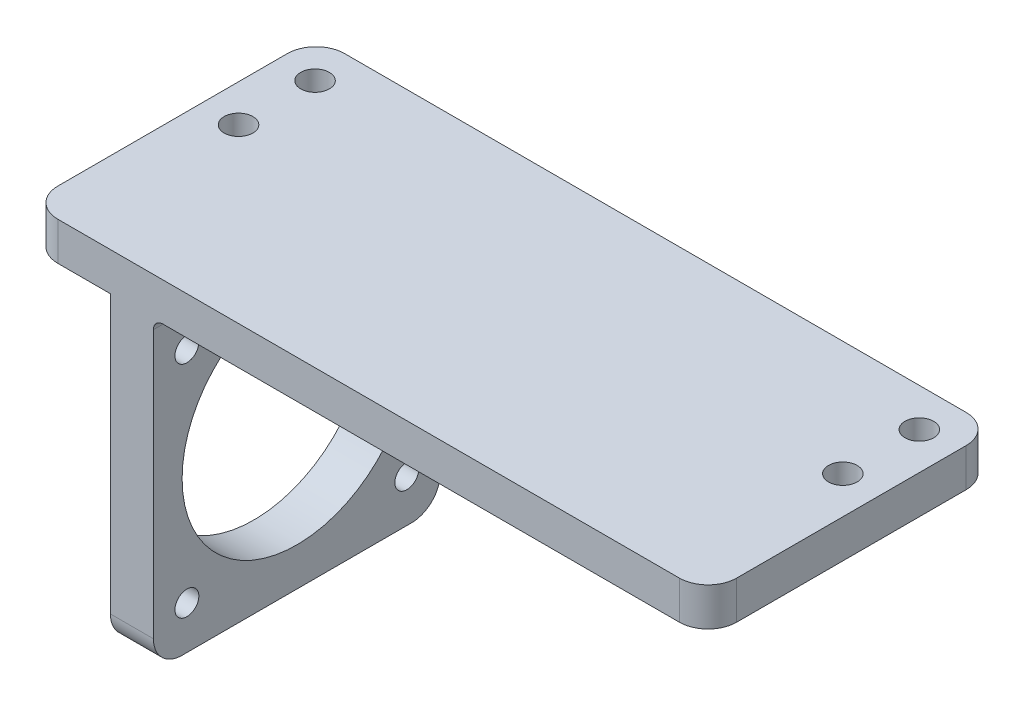
ISO-10303-21;
HEADER;
FILE_DESCRIPTION(('STEP AP214'),'2;1');
FILE_NAME('part.step','',(''),(''),'','','');
FILE_SCHEMA(('AUTOMOTIVE_DESIGN { 1 0 10303 214 1 1 1 1 }'));
ENDSEC;
DATA;
#1=APPLICATION_CONTEXT('core data for automotive mechanical design processes');
#2=APPLICATION_PROTOCOL_DEFINITION('international standard','automotive_design',2000,#1);
#3=PRODUCT_CONTEXT('',#1,'mechanical');
#4=PRODUCT('Part','Part','',(#3));
#5=PRODUCT_RELATED_PRODUCT_CATEGORY('part','',(#4));
#6=PRODUCT_DEFINITION_FORMATION('','',#4);
#7=PRODUCT_DEFINITION_CONTEXT('part definition',#1,'design');
#8=PRODUCT_DEFINITION('design','',#6,#7);
#9=PRODUCT_DEFINITION_SHAPE('','',#8);
#10=(LENGTH_UNIT() NAMED_UNIT(*) SI_UNIT(.MILLI.,.METRE.));
#11=(NAMED_UNIT(*) PLANE_ANGLE_UNIT() SI_UNIT($,.RADIAN.));
#12=(NAMED_UNIT(*) SI_UNIT($,.STERADIAN.) SOLID_ANGLE_UNIT());
#13=UNCERTAINTY_MEASURE_WITH_UNIT(LENGTH_MEASURE(1.E-05),#10,'distance_accuracy_value','');
#14=(GEOMETRIC_REPRESENTATION_CONTEXT(3) GLOBAL_UNCERTAINTY_ASSIGNED_CONTEXT((#13)) GLOBAL_UNIT_ASSIGNED_CONTEXT((#10,
#11,#12)) REPRESENTATION_CONTEXT('',''));
#15=CARTESIAN_POINT('',(0.,0.,0.));
#16=DIRECTION('',(0.,0.,1.));
#17=DIRECTION('',(1.,0.,0.));
#18=AXIS2_PLACEMENT_3D('',#15,#16,#17);
#19=CARTESIAN_POINT('',(0.,0.,0.));
#20=DIRECTION('',(0.,-1.,0.));
#21=DIRECTION('',(0.,0.,-1.));
#22=AXIS2_PLACEMENT_3D('',#19,#20,#21);
#23=PLANE('',#22);
#24=DIRECTION('',(0.,0.,-1.));
#25=VECTOR('',#24,1.);
#26=CARTESIAN_POINT('',(-27.,0.,15.));
#27=LINE('',#26,#25);
#28=CARTESIAN_POINT('',(-27.,0.,15.));
#29=VERTEX_POINT('',#28);
#30=CARTESIAN_POINT('',(-27.,0.,-15.));
#31=VERTEX_POINT('',#30);
#32=EDGE_CURVE('E338',#29,#31,#27,.T.);
#33=ORIENTED_EDGE('',*,*,#32,.F.);
#34=DIRECTION('',(1.,0.,0.));
#35=VECTOR('',#34,1.);
#36=CARTESIAN_POINT('',(-35.5,0.,15.));
#37=LINE('',#36,#35);
#38=CARTESIAN_POINT('',(-32.5,0.,15.));
#39=VERTEX_POINT('',#38);
#40=EDGE_CURVE('E184',#39,#29,#37,.T.);
#41=ORIENTED_EDGE('',*,*,#40,.F.);
#42=CARTESIAN_POINT('',(-32.5,0.,12.));
#43=DIRECTION('',(0.,-1.,0.));
#44=DIRECTION('',(0.,0.,-1.));
#45=AXIS2_PLACEMENT_3D('',#42,#43,#44);
#46=CIRCLE('',#45,3.);
#47=CARTESIAN_POINT('',(-35.5,0.,12.));
#48=VERTEX_POINT('',#47);
#49=EDGE_CURVE('E161',#39,#48,#46,.T.);
#50=ORIENTED_EDGE('',*,*,#49,.T.);
#51=DIRECTION('',(0.,0.,1.));
#52=VECTOR('',#51,1.);
#53=CARTESIAN_POINT('',(-35.5,0.,15.));
#54=LINE('',#53,#52);
#55=CARTESIAN_POINT('',(-35.5,0.,-12.));
#56=VERTEX_POINT('',#55);
#57=EDGE_CURVE('E167',#56,#48,#54,.T.);
#58=ORIENTED_EDGE('',*,*,#57,.F.);
#59=CARTESIAN_POINT('',(-32.5,0.,-12.));
#60=DIRECTION('',(0.,-1.,0.));
#61=DIRECTION('',(0.,0.,-1.));
#62=AXIS2_PLACEMENT_3D('',#59,#60,#61);
#63=CIRCLE('',#62,3.);
#64=CARTESIAN_POINT('',(-32.5,0.,-15.));
#65=VERTEX_POINT('',#64);
#66=EDGE_CURVE('E150',#56,#65,#63,.T.);
#67=ORIENTED_EDGE('',*,*,#66,.T.);
#68=DIRECTION('',(-1.,0.,0.));
#69=VECTOR('',#68,1.);
#70=CARTESIAN_POINT('',(-35.5,0.,-15.));
#71=LINE('',#70,#69);
#72=EDGE_CURVE('E186',#31,#65,#71,.T.);
#73=ORIENTED_EDGE('',*,*,#72,.F.);
#74=EDGE_LOOP('',(#33,#41,#50,#58,#67,#73));
#75=FACE_BOUND('',#74,.T.);
#76=CARTESIAN_POINT('',(-31.6,0.,-11.));
#77=DIRECTION('',(0.,1.,0.));
#78=DIRECTION('',(0.,0.,-1.));
#79=AXIS2_PLACEMENT_3D('',#76,#77,#78);
#80=CIRCLE('',#79,1.5);
#81=CARTESIAN_POINT('',(-31.6,0.,-12.5));
#82=VERTEX_POINT('',#81);
#83=EDGE_CURVE('E317',#82,#82,#80,.T.);
#84=ORIENTED_EDGE('',*,*,#83,.T.);
#85=EDGE_LOOP('',(#84));
#86=FACE_BOUND('',#85,.T.);
#87=CARTESIAN_POINT('',(-31.6,0.,-3.));
#88=DIRECTION('',(0.,1.,0.));
#89=DIRECTION('',(0.,0.,1.));
#90=AXIS2_PLACEMENT_3D('',#87,#88,#89);
#91=CIRCLE('',#90,1.5);
#92=CARTESIAN_POINT('',(-31.6,0.,-1.5));
#93=VERTEX_POINT('',#92);
#94=EDGE_CURVE('E309',#93,#93,#91,.T.);
#95=ORIENTED_EDGE('',*,*,#94,.T.);
#96=EDGE_LOOP('',(#95));
#97=FACE_BOUND('',#96,.T.);
#98=ADVANCED_FACE('F42',(#75,#86,#97),#23,.T.);
#99=CARTESIAN_POINT('',(0.,4.,0.));
#100=DIRECTION('',(0.,-1.,0.));
#101=DIRECTION('',(0.,0.,-1.));
#102=AXIS2_PLACEMENT_3D('',#99,#100,#101);
#103=PLANE('',#102);
#104=DIRECTION('',(-1.,0.,0.));
#105=VECTOR('',#104,1.);
#106=CARTESIAN_POINT('',(-35.5,4.,-15.));
#107=LINE('',#106,#105);
#108=CARTESIAN_POINT('',(32.5,4.,-15.));
#109=VERTEX_POINT('',#108);
#110=CARTESIAN_POINT('',(-32.5,4.,-15.));
#111=VERTEX_POINT('',#110);
#112=EDGE_CURVE('E272',#109,#111,#107,.T.);
#113=ORIENTED_EDGE('',*,*,#112,.T.);
#114=CARTESIAN_POINT('',(-32.5,4.,-12.));
#115=DIRECTION('',(0.,-1.,0.));
#116=DIRECTION('',(0.,0.,-1.));
#117=AXIS2_PLACEMENT_3D('',#114,#115,#116);
#118=CIRCLE('',#117,3.);
#119=CARTESIAN_POINT('',(-35.5,4.,-12.));
#120=VERTEX_POINT('',#119);
#121=EDGE_CURVE('E218',#111,#120,#118,.F.);
#122=ORIENTED_EDGE('',*,*,#121,.T.);
#123=DIRECTION('',(0.,0.,1.));
#124=VECTOR('',#123,1.);
#125=CARTESIAN_POINT('',(-35.5,4.,15.));
#126=LINE('',#125,#124);
#127=CARTESIAN_POINT('',(-35.5,4.,12.));
#128=VERTEX_POINT('',#127);
#129=EDGE_CURVE('E170',#120,#128,#126,.T.);
#130=ORIENTED_EDGE('',*,*,#129,.T.);
#131=CARTESIAN_POINT('',(-32.5,4.,12.));
#132=DIRECTION('',(0.,-1.,0.));
#133=DIRECTION('',(0.,0.,-1.));
#134=AXIS2_PLACEMENT_3D('',#131,#132,#133);
#135=CIRCLE('',#134,3.);
#136=CARTESIAN_POINT('',(-32.5,4.,15.));
#137=VERTEX_POINT('',#136);
#138=EDGE_CURVE('E215',#128,#137,#135,.F.);
#139=ORIENTED_EDGE('',*,*,#138,.T.);
#140=DIRECTION('',(1.,0.,0.));
#141=VECTOR('',#140,1.);
#142=CARTESIAN_POINT('',(-35.5,4.,15.));
#143=LINE('',#142,#141);
#144=CARTESIAN_POINT('',(32.5,4.,15.));
#145=VERTEX_POINT('',#144);
#146=EDGE_CURVE('E194',#137,#145,#143,.T.);
#147=ORIENTED_EDGE('',*,*,#146,.T.);
#148=CARTESIAN_POINT('',(32.5,4.,12.));
#149=DIRECTION('',(0.,-1.,0.));
#150=DIRECTION('',(0.,0.,-1.));
#151=AXIS2_PLACEMENT_3D('',#148,#149,#150);
#152=CIRCLE('',#151,3.);
#153=CARTESIAN_POINT('',(35.5,4.,12.));
#154=VERTEX_POINT('',#153);
#155=EDGE_CURVE('E209',#145,#154,#152,.F.);
#156=ORIENTED_EDGE('',*,*,#155,.T.);
#157=DIRECTION('',(0.,0.,-1.));
#158=VECTOR('',#157,1.);
#159=CARTESIAN_POINT('',(35.5,4.,15.));
#160=LINE('',#159,#158);
#161=CARTESIAN_POINT('',(35.5,4.,-12.));
#162=VERTEX_POINT('',#161);
#163=EDGE_CURVE('E192',#154,#162,#160,.T.);
#164=ORIENTED_EDGE('',*,*,#163,.T.);
#165=CARTESIAN_POINT('',(32.5,4.,-12.));
#166=DIRECTION('',(0.,-1.,0.));
#167=DIRECTION('',(0.,0.,-1.));
#168=AXIS2_PLACEMENT_3D('',#165,#166,#167);
#169=CIRCLE('',#168,3.);
#170=EDGE_CURVE('E212',#162,#109,#169,.F.);
#171=ORIENTED_EDGE('',*,*,#170,.T.);
#172=EDGE_LOOP('',(#113,#122,#130,#139,#147,#156,#164,#171));
#173=FACE_BOUND('',#172,.T.);
#174=CARTESIAN_POINT('',(31.6,4.,-11.));
#175=DIRECTION('',(0.,1.,0.));
#176=DIRECTION('',(0.,0.,1.));
#177=AXIS2_PLACEMENT_3D('',#174,#175,#176);
#178=CIRCLE('',#177,1.5);
#179=CARTESIAN_POINT('',(31.6,4.,-9.5));
#180=VERTEX_POINT('',#179);
#181=EDGE_CURVE('E288',#180,#180,#178,.T.);
#182=ORIENTED_EDGE('',*,*,#181,.F.);
#183=EDGE_LOOP('',(#182));
#184=FACE_BOUND('',#183,.T.);
#185=CARTESIAN_POINT('',(31.6,4.,-3.));
#186=DIRECTION('',(0.,1.,0.));
#187=DIRECTION('',(0.,0.,-1.));
#188=AXIS2_PLACEMENT_3D('',#185,#186,#187);
#189=CIRCLE('',#188,1.5);
#190=CARTESIAN_POINT('',(31.6,4.,-4.50000000000001));
#191=VERTEX_POINT('',#190);
#192=EDGE_CURVE('E299',#191,#191,#189,.T.);
#193=ORIENTED_EDGE('',*,*,#192,.F.);
#194=EDGE_LOOP('',(#193));
#195=FACE_BOUND('',#194,.T.);
#196=CARTESIAN_POINT('',(-31.6,4.,-3.));
#197=DIRECTION('',(0.,1.,0.));
#198=DIRECTION('',(0.,0.,1.));
#199=AXIS2_PLACEMENT_3D('',#196,#197,#198);
#200=CIRCLE('',#199,1.5);
#201=CARTESIAN_POINT('',(-31.6,4.,-1.5));
#202=VERTEX_POINT('',#201);
#203=EDGE_CURVE('E305',#202,#202,#200,.T.);
#204=ORIENTED_EDGE('',*,*,#203,.F.);
#205=EDGE_LOOP('',(#204));
#206=FACE_BOUND('',#205,.T.);
#207=CARTESIAN_POINT('',(-31.6,4.,-11.));
#208=DIRECTION('',(0.,1.,0.));
#209=DIRECTION('',(0.,0.,-1.));
#210=AXIS2_PLACEMENT_3D('',#207,#208,#209);
#211=CIRCLE('',#210,1.5);
#212=CARTESIAN_POINT('',(-31.6,4.,-12.5));
#213=VERTEX_POINT('',#212);
#214=EDGE_CURVE('E313',#213,#213,#211,.T.);
#215=ORIENTED_EDGE('',*,*,#214,.F.);
#216=EDGE_LOOP('',(#215));
#217=FACE_BOUND('',#216,.T.);
#218=ADVANCED_FACE('F429',(#173,#184,#195,#206,#217),#103,.F.);
#219=CARTESIAN_POINT('',(-21.5,0.,15.));
#220=VERTEX_POINT('',#219);
#221=CARTESIAN_POINT('',(32.5,0.,15.));
#222=VERTEX_POINT('',#221);
#223=EDGE_CURVE('E179',#220,#222,#37,.T.);
#224=ORIENTED_EDGE('',*,*,#223,.F.);
#225=DIRECTION('',(0.,0.,1.));
#226=VECTOR('',#225,1.);
#227=CARTESIAN_POINT('',(-21.5,0.,0.));
#228=LINE('',#227,#226);
#229=CARTESIAN_POINT('',(-21.5,0.,-15.));
#230=VERTEX_POINT('',#229);
#231=EDGE_CURVE('E64',#220,#230,#228,.F.);
#232=ORIENTED_EDGE('',*,*,#231,.T.);
#233=CARTESIAN_POINT('',(32.5,0.,-15.));
#234=VERTEX_POINT('',#233);
#235=EDGE_CURVE('E180',#234,#230,#71,.T.);
#236=ORIENTED_EDGE('',*,*,#235,.F.);
#237=CARTESIAN_POINT('',(32.5,0.,-12.));
#238=DIRECTION('',(0.,-1.,0.));
#239=DIRECTION('',(0.,0.,-1.));
#240=AXIS2_PLACEMENT_3D('',#237,#238,#239);
#241=CIRCLE('',#240,3.);
#242=CARTESIAN_POINT('',(35.5,0.,-12.));
#243=VERTEX_POINT('',#242);
#244=EDGE_CURVE('E199',#234,#243,#241,.T.);
#245=ORIENTED_EDGE('',*,*,#244,.T.);
#246=DIRECTION('',(0.,0.,-1.));
#247=VECTOR('',#246,1.);
#248=CARTESIAN_POINT('',(35.5,0.,15.));
#249=LINE('',#248,#247);
#250=CARTESIAN_POINT('',(35.5,0.,12.));
#251=VERTEX_POINT('',#250);
#252=EDGE_CURVE('E285',#251,#243,#249,.T.);
#253=ORIENTED_EDGE('',*,*,#252,.F.);
#254=CARTESIAN_POINT('',(32.5,0.,12.));
#255=DIRECTION('',(0.,-1.,0.));
#256=DIRECTION('',(0.,0.,-1.));
#257=AXIS2_PLACEMENT_3D('',#254,#255,#256);
#258=CIRCLE('',#257,3.);
#259=EDGE_CURVE('E172',#251,#222,#258,.T.);
#260=ORIENTED_EDGE('',*,*,#259,.T.);
#261=EDGE_LOOP('',(#224,#232,#236,#245,#253,#260));
#262=FACE_BOUND('',#261,.T.);
#263=CARTESIAN_POINT('',(31.6,0.,-11.));
#264=DIRECTION('',(0.,1.,0.));
#265=DIRECTION('',(0.,0.,1.));
#266=AXIS2_PLACEMENT_3D('',#263,#264,#265);
#267=CIRCLE('',#266,1.5);
#268=CARTESIAN_POINT('',(31.6,0.,-9.5));
#269=VERTEX_POINT('',#268);
#270=EDGE_CURVE('E283',#269,#269,#267,.T.);
#271=ORIENTED_EDGE('',*,*,#270,.T.);
#272=EDGE_LOOP('',(#271));
#273=FACE_BOUND('',#272,.T.);
#274=CARTESIAN_POINT('',(31.6,0.,-3.));
#275=DIRECTION('',(0.,1.,0.));
#276=DIRECTION('',(0.,0.,-1.));
#277=AXIS2_PLACEMENT_3D('',#274,#275,#276);
#278=CIRCLE('',#277,1.5);
#279=CARTESIAN_POINT('',(31.6,0.,-4.50000000000001));
#280=VERTEX_POINT('',#279);
#281=EDGE_CURVE('E301',#280,#280,#278,.T.);
#282=ORIENTED_EDGE('',*,*,#281,.T.);
#283=EDGE_LOOP('',(#282));
#284=FACE_BOUND('',#283,.T.);
#285=ADVANCED_FACE('F434',(#262,#273,#284),#23,.T.);
#286=CARTESIAN_POINT('',(35.5,4.,15.));
#287=DIRECTION('',(-1.,0.,0.));
#288=DIRECTION('',(0.,0.,1.));
#289=AXIS2_PLACEMENT_3D('',#286,#287,#288);
#290=PLANE('',#289);
#291=ORIENTED_EDGE('',*,*,#252,.T.);
#292=DIRECTION('',(0.,-1.,0.));
#293=VECTOR('',#292,1.);
#294=CARTESIAN_POINT('',(35.5,4.,-12.));
#295=LINE('',#294,#293);
#296=EDGE_CURVE('E232',#243,#162,#295,.F.);
#297=ORIENTED_EDGE('',*,*,#296,.T.);
#298=ORIENTED_EDGE('',*,*,#163,.F.);
#299=DIRECTION('',(0.,-1.,0.));
#300=VECTOR('',#299,1.);
#301=CARTESIAN_POINT('',(35.5,4.,12.));
#302=LINE('',#301,#300);
#303=EDGE_CURVE('E228',#154,#251,#302,.T.);
#304=ORIENTED_EDGE('',*,*,#303,.T.);
#305=EDGE_LOOP('',(#291,#297,#298,#304));
#306=FACE_BOUND('',#305,.T.);
#307=ADVANCED_FACE('F461',(#306),#290,.F.);
#308=CARTESIAN_POINT('',(-35.5,4.,-15.));
#309=DIRECTION('',(0.,0.,1.));
#310=DIRECTION('',(1.,0.,0.));
#311=AXIS2_PLACEMENT_3D('',#308,#309,#310);
#312=PLANE('',#311);
#313=DIRECTION('',(0.,1.,0.));
#314=VECTOR('',#313,1.);
#315=CARTESIAN_POINT('',(-22.5,-32.,-15.));
#316=LINE('',#315,#314);
#317=CARTESIAN_POINT('',(-22.5,-29.,-15.));
#318=VERTEX_POINT('',#317);
#319=CARTESIAN_POINT('',(-22.5,-1.,-15.));
#320=VERTEX_POINT('',#319);
#321=EDGE_CURVE('E321',#318,#320,#316,.T.);
#322=ORIENTED_EDGE('',*,*,#321,.F.);
#323=DIRECTION('',(1.,0.,0.));
#324=VECTOR('',#323,1.);
#325=CARTESIAN_POINT('',(-27.,-29.,-15.));
#326=LINE('',#325,#324);
#327=CARTESIAN_POINT('',(-27.,-29.,-15.));
#328=VERTEX_POINT('',#327);
#329=EDGE_CURVE('E249',#318,#328,#326,.F.);
#330=ORIENTED_EDGE('',*,*,#329,.T.);
#331=DIRECTION('',(0.,1.,0.));
#332=VECTOR('',#331,1.);
#333=CARTESIAN_POINT('',(-27.,-32.,-15.));
#334=LINE('',#333,#332);
#335=EDGE_CURVE('E334',#328,#31,#334,.T.);
#336=ORIENTED_EDGE('',*,*,#335,.T.);
#337=ORIENTED_EDGE('',*,*,#72,.T.);
#338=DIRECTION('',(0.,-1.,0.));
#339=VECTOR('',#338,1.);
#340=CARTESIAN_POINT('',(-32.5,4.,-15.));
#341=LINE('',#340,#339);
#342=EDGE_CURVE('E155',#65,#111,#341,.F.);
#343=ORIENTED_EDGE('',*,*,#342,.T.);
#344=ORIENTED_EDGE('',*,*,#112,.F.);
#345=DIRECTION('',(0.,-1.,0.));
#346=VECTOR('',#345,1.);
#347=CARTESIAN_POINT('',(32.5,4.,-15.));
#348=LINE('',#347,#346);
#349=EDGE_CURVE('E160',#109,#234,#348,.T.);
#350=ORIENTED_EDGE('',*,*,#349,.T.);
#351=ORIENTED_EDGE('',*,*,#235,.T.);
#352=CARTESIAN_POINT('',(-21.5,-1.,-15.));
#353=DIRECTION('',(0.,0.,1.));
#354=DIRECTION('',(1.,0.,0.));
#355=AXIS2_PLACEMENT_3D('',#352,#353,#354);
#356=CIRCLE('',#355,1.);
#357=EDGE_CURVE('E11',#230,#320,#356,.T.);
#358=ORIENTED_EDGE('',*,*,#357,.T.);
#359=EDGE_LOOP('',(#322,#330,#336,#337,#343,#344,#350,#351,#358));
#360=FACE_BOUND('',#359,.T.);
#361=ADVANCED_FACE('F426',(#360),#312,.F.);
#362=CARTESIAN_POINT('',(-35.5,4.,15.));
#363=DIRECTION('',(1.,0.,0.));
#364=DIRECTION('',(0.,0.,-1.));
#365=AXIS2_PLACEMENT_3D('',#362,#363,#364);
#366=PLANE('',#365);
#367=ORIENTED_EDGE('',*,*,#129,.F.);
#368=DIRECTION('',(0.,-1.,0.));
#369=VECTOR('',#368,1.);
#370=CARTESIAN_POINT('',(-35.5,4.,-12.));
#371=LINE('',#370,#369);
#372=EDGE_CURVE('E154',#120,#56,#371,.T.);
#373=ORIENTED_EDGE('',*,*,#372,.T.);
#374=ORIENTED_EDGE('',*,*,#57,.T.);
#375=DIRECTION('',(0.,-1.,0.));
#376=VECTOR('',#375,1.);
#377=CARTESIAN_POINT('',(-35.5,4.,12.));
#378=LINE('',#377,#376);
#379=EDGE_CURVE('E173',#48,#128,#378,.F.);
#380=ORIENTED_EDGE('',*,*,#379,.T.);
#381=EDGE_LOOP('',(#367,#373,#374,#380));
#382=FACE_BOUND('',#381,.T.);
#383=ADVANCED_FACE('F166',(#382),#366,.F.);
#384=CARTESIAN_POINT('',(-35.5,4.,15.));
#385=DIRECTION('',(0.,0.,-1.));
#386=DIRECTION('',(-1.,0.,0.));
#387=AXIS2_PLACEMENT_3D('',#384,#385,#386);
#388=PLANE('',#387);
#389=DIRECTION('',(0.,1.,0.));
#390=VECTOR('',#389,1.);
#391=CARTESIAN_POINT('',(-27.,-32.,15.));
#392=LINE('',#391,#390);
#393=CARTESIAN_POINT('',(-27.,-29.,15.));
#394=VERTEX_POINT('',#393);
#395=EDGE_CURVE('E331',#394,#29,#392,.T.);
#396=ORIENTED_EDGE('',*,*,#395,.F.);
#397=DIRECTION('',(-1.,0.,0.));
#398=VECTOR('',#397,1.);
#399=CARTESIAN_POINT('',(-22.5,-29.,15.));
#400=LINE('',#399,#398);
#401=CARTESIAN_POINT('',(-22.5,-29.,15.));
#402=VERTEX_POINT('',#401);
#403=EDGE_CURVE('E258',#394,#402,#400,.F.);
#404=ORIENTED_EDGE('',*,*,#403,.T.);
#405=DIRECTION('',(0.,1.,0.));
#406=VECTOR('',#405,1.);
#407=CARTESIAN_POINT('',(-22.5,-32.,15.));
#408=LINE('',#407,#406);
#409=CARTESIAN_POINT('',(-22.5,-1.,15.));
#410=VERTEX_POINT('',#409);
#411=EDGE_CURVE('E328',#402,#410,#408,.T.);
#412=ORIENTED_EDGE('',*,*,#411,.T.);
#413=CARTESIAN_POINT('',(-21.5,-1.,15.));
#414=DIRECTION('',(0.,0.,-1.));
#415=DIRECTION('',(-1.,0.,0.));
#416=AXIS2_PLACEMENT_3D('',#413,#414,#415);
#417=CIRCLE('',#416,1.);
#418=EDGE_CURVE('E51',#410,#220,#417,.T.);
#419=ORIENTED_EDGE('',*,*,#418,.T.);
#420=ORIENTED_EDGE('',*,*,#223,.T.);
#421=DIRECTION('',(0.,-1.,0.));
#422=VECTOR('',#421,1.);
#423=CARTESIAN_POINT('',(32.5,4.,15.));
#424=LINE('',#423,#422);
#425=EDGE_CURVE('E221',#222,#145,#424,.F.);
#426=ORIENTED_EDGE('',*,*,#425,.T.);
#427=ORIENTED_EDGE('',*,*,#146,.F.);
#428=DIRECTION('',(0.,-1.,0.));
#429=VECTOR('',#428,1.);
#430=CARTESIAN_POINT('',(-32.5,4.,15.));
#431=LINE('',#430,#429);
#432=EDGE_CURVE('E224',#137,#39,#431,.T.);
#433=ORIENTED_EDGE('',*,*,#432,.T.);
#434=ORIENTED_EDGE('',*,*,#40,.T.);
#435=EDGE_LOOP('',(#396,#404,#412,#419,#420,#426,#427,#433,#434));
#436=FACE_BOUND('',#435,.T.);
#437=ADVANCED_FACE('F423',(#436),#388,.F.);
#438=CARTESIAN_POINT('',(31.6,4.,-11.));
#439=DIRECTION('',(0.,-1.,0.));
#440=DIRECTION('',(0.,0.,-1.));
#441=AXIS2_PLACEMENT_3D('',#438,#439,#440);
#442=CYLINDRICAL_SURFACE('',#441,1.5);
#443=ORIENTED_EDGE('',*,*,#181,.T.);
#444=EDGE_LOOP('',(#443));
#445=FACE_BOUND('',#444,.T.);
#446=ORIENTED_EDGE('',*,*,#270,.F.);
#447=EDGE_LOOP('',(#446));
#448=FACE_BOUND('',#447,.T.);
#449=ADVANCED_FACE('F473',(#445,#448),#442,.F.);
#450=CARTESIAN_POINT('',(31.6,4.,-3.));
#451=DIRECTION('',(0.,-1.,0.));
#452=DIRECTION('',(0.,0.,-1.));
#453=AXIS2_PLACEMENT_3D('',#450,#451,#452);
#454=CYLINDRICAL_SURFACE('',#453,1.5);
#455=ORIENTED_EDGE('',*,*,#192,.T.);
#456=EDGE_LOOP('',(#455));
#457=FACE_BOUND('',#456,.T.);
#458=ORIENTED_EDGE('',*,*,#281,.F.);
#459=EDGE_LOOP('',(#458));
#460=FACE_BOUND('',#459,.T.);
#461=ADVANCED_FACE('F477',(#457,#460),#454,.F.);
#462=CARTESIAN_POINT('',(-31.6,4.,-3.));
#463=DIRECTION('',(0.,-1.,0.));
#464=DIRECTION('',(0.,0.,-1.));
#465=AXIS2_PLACEMENT_3D('',#462,#463,#464);
#466=CYLINDRICAL_SURFACE('',#465,1.5);
#467=ORIENTED_EDGE('',*,*,#203,.T.);
#468=EDGE_LOOP('',(#467));
#469=FACE_BOUND('',#468,.T.);
#470=ORIENTED_EDGE('',*,*,#94,.F.);
#471=EDGE_LOOP('',(#470));
#472=FACE_BOUND('',#471,.T.);
#473=ADVANCED_FACE('F482',(#469,#472),#466,.F.);
#474=CARTESIAN_POINT('',(-31.6,4.,-11.));
#475=DIRECTION('',(0.,-1.,0.));
#476=DIRECTION('',(0.,0.,-1.));
#477=AXIS2_PLACEMENT_3D('',#474,#475,#476);
#478=CYLINDRICAL_SURFACE('',#477,1.5);
#479=ORIENTED_EDGE('',*,*,#214,.T.);
#480=EDGE_LOOP('',(#479));
#481=FACE_BOUND('',#480,.T.);
#482=ORIENTED_EDGE('',*,*,#83,.F.);
#483=EDGE_LOOP('',(#482));
#484=FACE_BOUND('',#483,.T.);
#485=ADVANCED_FACE('F451',(#481,#484),#478,.F.);
#486=CARTESIAN_POINT('',(-32.5,4.,-12.));
#487=DIRECTION('',(0.,-1.,0.));
#488=DIRECTION('',(0.,0.,-1.));
#489=AXIS2_PLACEMENT_3D('',#486,#487,#488);
#490=CYLINDRICAL_SURFACE('',#489,3.);
#491=ORIENTED_EDGE('',*,*,#121,.F.);
#492=ORIENTED_EDGE('',*,*,#342,.F.);
#493=ORIENTED_EDGE('',*,*,#66,.F.);
#494=ORIENTED_EDGE('',*,*,#372,.F.);
#495=EDGE_LOOP('',(#491,#492,#493,#494));
#496=FACE_BOUND('',#495,.T.);
#497=ADVANCED_FACE('F153',(#496),#490,.T.);
#498=CARTESIAN_POINT('',(-32.5,4.,12.));
#499=DIRECTION('',(0.,-1.,0.));
#500=DIRECTION('',(0.,0.,-1.));
#501=AXIS2_PLACEMENT_3D('',#498,#499,#500);
#502=CYLINDRICAL_SURFACE('',#501,3.);
#503=ORIENTED_EDGE('',*,*,#138,.F.);
#504=ORIENTED_EDGE('',*,*,#379,.F.);
#505=ORIENTED_EDGE('',*,*,#49,.F.);
#506=ORIENTED_EDGE('',*,*,#432,.F.);
#507=EDGE_LOOP('',(#503,#504,#505,#506));
#508=FACE_BOUND('',#507,.T.);
#509=ADVANCED_FACE('F443',(#508),#502,.T.);
#510=CARTESIAN_POINT('',(32.5,4.,-12.));
#511=DIRECTION('',(0.,-1.,0.));
#512=DIRECTION('',(0.,0.,-1.));
#513=AXIS2_PLACEMENT_3D('',#510,#511,#512);
#514=CYLINDRICAL_SURFACE('',#513,3.);
#515=ORIENTED_EDGE('',*,*,#170,.F.);
#516=ORIENTED_EDGE('',*,*,#296,.F.);
#517=ORIENTED_EDGE('',*,*,#244,.F.);
#518=ORIENTED_EDGE('',*,*,#349,.F.);
#519=EDGE_LOOP('',(#515,#516,#517,#518));
#520=FACE_BOUND('',#519,.T.);
#521=ADVANCED_FACE('F432',(#520),#514,.T.);
#522=CARTESIAN_POINT('',(32.5,4.,12.));
#523=DIRECTION('',(0.,-1.,0.));
#524=DIRECTION('',(0.,0.,-1.));
#525=AXIS2_PLACEMENT_3D('',#522,#523,#524);
#526=CYLINDRICAL_SURFACE('',#525,3.);
#527=ORIENTED_EDGE('',*,*,#155,.F.);
#528=ORIENTED_EDGE('',*,*,#425,.F.);
#529=ORIENTED_EDGE('',*,*,#259,.F.);
#530=ORIENTED_EDGE('',*,*,#303,.F.);
#531=EDGE_LOOP('',(#527,#528,#529,#530));
#532=FACE_BOUND('',#531,.T.);
#533=ADVANCED_FACE('F440',(#532),#526,.T.);
#534=CARTESIAN_POINT('',(-22.5,-32.,-15.));
#535=DIRECTION('',(-1.,0.,0.));
#536=DIRECTION('',(0.,0.,1.));
#537=AXIS2_PLACEMENT_3D('',#534,#535,#536);
#538=PLANE('',#537);
#539=CARTESIAN_POINT('',(-22.5,-27.5,11.5));
#540=DIRECTION('',(-1.,0.,0.));
#541=DIRECTION('',(0.,0.,1.));
#542=AXIS2_PLACEMENT_3D('',#539,#540,#541);
#543=CIRCLE('',#542,1.25);
#544=CARTESIAN_POINT('',(-22.5,-27.5,12.75));
#545=VERTEX_POINT('',#544);
#546=EDGE_CURVE('E343',#545,#545,#543,.T.);
#547=ORIENTED_EDGE('',*,*,#546,.T.);
#548=EDGE_LOOP('',(#547));
#549=FACE_BOUND('',#548,.T.);
#550=CARTESIAN_POINT('',(-22.5,-27.5,-11.5));
#551=DIRECTION('',(-1.,0.,0.));
#552=DIRECTION('',(0.,0.,1.));
#553=AXIS2_PLACEMENT_3D('',#550,#551,#552);
#554=CIRCLE('',#553,1.25);
#555=CARTESIAN_POINT('',(-22.5,-27.5,-10.25));
#556=VERTEX_POINT('',#555);
#557=EDGE_CURVE('E353',#556,#556,#554,.T.);
#558=ORIENTED_EDGE('',*,*,#557,.T.);
#559=EDGE_LOOP('',(#558));
#560=FACE_BOUND('',#559,.T.);
#561=CARTESIAN_POINT('',(-22.5,-16.,0.));
#562=DIRECTION('',(-1.,0.,0.));
#563=DIRECTION('',(0.,0.,1.));
#564=AXIS2_PLACEMENT_3D('',#561,#562,#563);
#565=CIRCLE('',#564,12.);
#566=CARTESIAN_POINT('',(-22.5,-16.,12.));
#567=VERTEX_POINT('',#566);
#568=EDGE_CURVE('E357',#567,#567,#565,.T.);
#569=ORIENTED_EDGE('',*,*,#568,.T.);
#570=EDGE_LOOP('',(#569));
#571=FACE_BOUND('',#570,.T.);
#572=CARTESIAN_POINT('',(-22.5,-4.5,-11.5));
#573=DIRECTION('',(-1.,0.,0.));
#574=DIRECTION('',(0.,0.,1.));
#575=AXIS2_PLACEMENT_3D('',#572,#573,#574);
#576=CIRCLE('',#575,1.25);
#577=CARTESIAN_POINT('',(-22.5,-4.5,-10.25));
#578=VERTEX_POINT('',#577);
#579=EDGE_CURVE('E361',#578,#578,#576,.T.);
#580=ORIENTED_EDGE('',*,*,#579,.T.);
#581=EDGE_LOOP('',(#580));
#582=FACE_BOUND('',#581,.T.);
#583=CARTESIAN_POINT('',(-22.5,-4.5,11.5));
#584=DIRECTION('',(-1.,0.,0.));
#585=DIRECTION('',(0.,0.,1.));
#586=AXIS2_PLACEMENT_3D('',#583,#584,#585);
#587=CIRCLE('',#586,1.25);
#588=CARTESIAN_POINT('',(-22.5,-4.5,12.75));
#589=VERTEX_POINT('',#588);
#590=EDGE_CURVE('E365',#589,#589,#587,.T.);
#591=ORIENTED_EDGE('',*,*,#590,.T.);
#592=EDGE_LOOP('',(#591));
#593=FACE_BOUND('',#592,.T.);
#594=ORIENTED_EDGE('',*,*,#321,.T.);
#595=DIRECTION('',(0.,0.,1.));
#596=VECTOR('',#595,1.);
#597=CARTESIAN_POINT('',(-22.5,-1.,-15.));
#598=LINE('',#597,#596);
#599=EDGE_CURVE('E261',#320,#410,#598,.T.);
#600=ORIENTED_EDGE('',*,*,#599,.T.);
#601=ORIENTED_EDGE('',*,*,#411,.F.);
#602=CARTESIAN_POINT('',(-22.5,-29.,12.));
#603=DIRECTION('',(-1.,0.,0.));
#604=DIRECTION('',(0.,0.,1.));
#605=AXIS2_PLACEMENT_3D('',#602,#603,#604);
#606=CIRCLE('',#605,3.);
#607=CARTESIAN_POINT('',(-22.5,-32.,12.));
#608=VERTEX_POINT('',#607);
#609=EDGE_CURVE('E243',#402,#608,#606,.F.);
#610=ORIENTED_EDGE('',*,*,#609,.T.);
#611=DIRECTION('',(0.,0.,1.));
#612=VECTOR('',#611,1.);
#613=CARTESIAN_POINT('',(-22.5,-32.,-15.));
#614=LINE('',#613,#612);
#615=CARTESIAN_POINT('',(-22.5,-32.,-12.));
#616=VERTEX_POINT('',#615);
#617=EDGE_CURVE('E342',#616,#608,#614,.T.);
#618=ORIENTED_EDGE('',*,*,#617,.F.);
#619=CARTESIAN_POINT('',(-22.5,-29.,-12.));
#620=DIRECTION('',(-1.,0.,0.));
#621=DIRECTION('',(0.,0.,1.));
#622=AXIS2_PLACEMENT_3D('',#619,#620,#621);
#623=CIRCLE('',#622,3.);
#624=EDGE_CURVE('E246',#616,#318,#623,.F.);
#625=ORIENTED_EDGE('',*,*,#624,.T.);
#626=EDGE_LOOP('',(#594,#600,#601,#610,#618,#625));
#627=FACE_BOUND('',#626,.T.);
#628=ADVANCED_FACE('F397',(#549,#560,#571,#582,#593,#627),#538,.F.);
#629=CARTESIAN_POINT('',(-27.,-32.,15.));
#630=DIRECTION('',(1.,0.,0.));
#631=DIRECTION('',(0.,0.,-1.));
#632=AXIS2_PLACEMENT_3D('',#629,#630,#631);
#633=PLANE('',#632);
#634=CARTESIAN_POINT('',(-27.,-27.5,11.5));
#635=DIRECTION('',(-1.,0.,0.));
#636=DIRECTION('',(0.,0.,-1.));
#637=AXIS2_PLACEMENT_3D('',#634,#635,#636);
#638=CIRCLE('',#637,1.25);
#639=CARTESIAN_POINT('',(-27.,-27.5,10.25));
#640=VERTEX_POINT('',#639);
#641=EDGE_CURVE('E373',#640,#640,#638,.T.);
#642=ORIENTED_EDGE('',*,*,#641,.F.);
#643=EDGE_LOOP('',(#642));
#644=FACE_BOUND('',#643,.T.);
#645=CARTESIAN_POINT('',(-27.,-27.5,-11.5));
#646=DIRECTION('',(-1.,0.,0.));
#647=DIRECTION('',(0.,0.,1.));
#648=AXIS2_PLACEMENT_3D('',#645,#646,#647);
#649=CIRCLE('',#648,1.25);
#650=CARTESIAN_POINT('',(-27.,-27.5,-10.25));
#651=VERTEX_POINT('',#650);
#652=EDGE_CURVE('E374',#651,#651,#649,.T.);
#653=ORIENTED_EDGE('',*,*,#652,.F.);
#654=EDGE_LOOP('',(#653));
#655=FACE_BOUND('',#654,.T.);
#656=CARTESIAN_POINT('',(-27.,-16.,0.));
#657=DIRECTION('',(-1.,0.,0.));
#658=DIRECTION('',(0.,0.,1.));
#659=AXIS2_PLACEMENT_3D('',#656,#657,#658);
#660=CIRCLE('',#659,12.);
#661=CARTESIAN_POINT('',(-27.,-16.,12.));
#662=VERTEX_POINT('',#661);
#663=EDGE_CURVE('E385',#662,#662,#660,.T.);
#664=ORIENTED_EDGE('',*,*,#663,.F.);
#665=EDGE_LOOP('',(#664));
#666=FACE_BOUND('',#665,.T.);
#667=CARTESIAN_POINT('',(-27.,-4.5,-11.5));
#668=DIRECTION('',(-1.,0.,0.));
#669=DIRECTION('',(0.,0.,-1.));
#670=AXIS2_PLACEMENT_3D('',#667,#668,#669);
#671=CIRCLE('',#670,1.25);
#672=CARTESIAN_POINT('',(-27.,-4.5,-12.75));
#673=VERTEX_POINT('',#672);
#674=EDGE_CURVE('E378',#673,#673,#671,.T.);
#675=ORIENTED_EDGE('',*,*,#674,.F.);
#676=EDGE_LOOP('',(#675));
#677=FACE_BOUND('',#676,.T.);
#678=CARTESIAN_POINT('',(-27.,-4.5,11.5));
#679=DIRECTION('',(-1.,0.,0.));
#680=DIRECTION('',(0.,0.,1.));
#681=AXIS2_PLACEMENT_3D('',#678,#679,#680);
#682=CIRCLE('',#681,1.25);
#683=CARTESIAN_POINT('',(-27.,-4.5,12.75));
#684=VERTEX_POINT('',#683);
#685=EDGE_CURVE('E369',#684,#684,#682,.T.);
#686=ORIENTED_EDGE('',*,*,#685,.F.);
#687=EDGE_LOOP('',(#686));
#688=FACE_BOUND('',#687,.T.);
#689=ORIENTED_EDGE('',*,*,#335,.F.);
#690=CARTESIAN_POINT('',(-27.,-29.,-12.));
#691=DIRECTION('',(1.,0.,0.));
#692=DIRECTION('',(0.,0.,-1.));
#693=AXIS2_PLACEMENT_3D('',#690,#691,#692);
#694=CIRCLE('',#693,3.);
#695=CARTESIAN_POINT('',(-27.,-32.,-12.));
#696=VERTEX_POINT('',#695);
#697=EDGE_CURVE('E255',#328,#696,#694,.F.);
#698=ORIENTED_EDGE('',*,*,#697,.T.);
#699=DIRECTION('',(0.,0.,-1.));
#700=VECTOR('',#699,1.);
#701=CARTESIAN_POINT('',(-27.,-32.,15.));
#702=LINE('',#701,#700);
#703=CARTESIAN_POINT('',(-27.,-32.,12.));
#704=VERTEX_POINT('',#703);
#705=EDGE_CURVE('E337',#704,#696,#702,.T.);
#706=ORIENTED_EDGE('',*,*,#705,.F.);
#707=CARTESIAN_POINT('',(-27.,-29.,12.));
#708=DIRECTION('',(1.,0.,0.));
#709=DIRECTION('',(0.,0.,-1.));
#710=AXIS2_PLACEMENT_3D('',#707,#708,#709);
#711=CIRCLE('',#710,3.);
#712=EDGE_CURVE('E252',#704,#394,#711,.F.);
#713=ORIENTED_EDGE('',*,*,#712,.T.);
#714=ORIENTED_EDGE('',*,*,#395,.T.);
#715=ORIENTED_EDGE('',*,*,#32,.T.);
#716=EDGE_LOOP('',(#689,#698,#706,#713,#714,#715));
#717=FACE_BOUND('',#716,.T.);
#718=ADVANCED_FACE('F393',(#644,#655,#666,#677,#688,#717),#633,.F.);
#719=CARTESIAN_POINT('',(0.,-32.,0.));
#720=DIRECTION('',(0.,-1.,0.));
#721=DIRECTION('',(0.,0.,-1.));
#722=AXIS2_PLACEMENT_3D('',#719,#720,#721);
#723=PLANE('',#722);
#724=ORIENTED_EDGE('',*,*,#705,.T.);
#725=DIRECTION('',(1.,0.,0.));
#726=VECTOR('',#725,1.);
#727=CARTESIAN_POINT('',(-22.5,-32.,-12.));
#728=LINE('',#727,#726);
#729=EDGE_CURVE('E239',#696,#616,#728,.T.);
#730=ORIENTED_EDGE('',*,*,#729,.T.);
#731=ORIENTED_EDGE('',*,*,#617,.T.);
#732=DIRECTION('',(-1.,0.,0.));
#733=VECTOR('',#732,1.);
#734=CARTESIAN_POINT('',(-27.,-32.,12.));
#735=LINE('',#734,#733);
#736=EDGE_CURVE('E235',#608,#704,#735,.T.);
#737=ORIENTED_EDGE('',*,*,#736,.T.);
#738=EDGE_LOOP('',(#724,#730,#731,#737));
#739=FACE_BOUND('',#738,.T.);
#740=ADVANCED_FACE('F396',(#739),#723,.T.);
#741=CARTESIAN_POINT('',(3.,-4.5,11.5));
#742=DIRECTION('',(-1.,0.,0.));
#743=DIRECTION('',(0.,0.,1.));
#744=AXIS2_PLACEMENT_3D('',#741,#742,#743);
#745=CYLINDRICAL_SURFACE('',#744,1.25);
#746=ORIENTED_EDGE('',*,*,#685,.T.);
#747=EDGE_LOOP('',(#746));
#748=FACE_BOUND('',#747,.T.);
#749=ORIENTED_EDGE('',*,*,#590,.F.);
#750=EDGE_LOOP('',(#749));
#751=FACE_BOUND('',#750,.T.);
#752=ADVANCED_FACE('F498',(#748,#751),#745,.F.);
#753=CARTESIAN_POINT('',(3.,-4.5,-11.5));
#754=DIRECTION('',(-1.,0.,0.));
#755=DIRECTION('',(0.,0.,1.));
#756=AXIS2_PLACEMENT_3D('',#753,#754,#755);
#757=CYLINDRICAL_SURFACE('',#756,1.25);
#758=ORIENTED_EDGE('',*,*,#674,.T.);
#759=EDGE_LOOP('',(#758));
#760=FACE_BOUND('',#759,.T.);
#761=ORIENTED_EDGE('',*,*,#579,.F.);
#762=EDGE_LOOP('',(#761));
#763=FACE_BOUND('',#762,.T.);
#764=ADVANCED_FACE('F501',(#760,#763),#757,.F.);
#765=CARTESIAN_POINT('',(3.,-16.,0.));
#766=DIRECTION('',(-1.,0.,0.));
#767=DIRECTION('',(0.,0.,1.));
#768=AXIS2_PLACEMENT_3D('',#765,#766,#767);
#769=CYLINDRICAL_SURFACE('',#768,12.);
#770=ORIENTED_EDGE('',*,*,#663,.T.);
#771=EDGE_LOOP('',(#770));
#772=FACE_BOUND('',#771,.T.);
#773=ORIENTED_EDGE('',*,*,#568,.F.);
#774=EDGE_LOOP('',(#773));
#775=FACE_BOUND('',#774,.T.);
#776=ADVANCED_FACE('F390',(#772,#775),#769,.F.);
#777=CARTESIAN_POINT('',(3.,-27.5,-11.5));
#778=DIRECTION('',(-1.,0.,0.));
#779=DIRECTION('',(0.,0.,1.));
#780=AXIS2_PLACEMENT_3D('',#777,#778,#779);
#781=CYLINDRICAL_SURFACE('',#780,1.25);
#782=ORIENTED_EDGE('',*,*,#652,.T.);
#783=EDGE_LOOP('',(#782));
#784=FACE_BOUND('',#783,.T.);
#785=ORIENTED_EDGE('',*,*,#557,.F.);
#786=EDGE_LOOP('',(#785));
#787=FACE_BOUND('',#786,.T.);
#788=ADVANCED_FACE('F503',(#784,#787),#781,.F.);
#789=CARTESIAN_POINT('',(3.,-27.5,11.5));
#790=DIRECTION('',(-1.,0.,0.));
#791=DIRECTION('',(0.,0.,1.));
#792=AXIS2_PLACEMENT_3D('',#789,#790,#791);
#793=CYLINDRICAL_SURFACE('',#792,1.25);
#794=ORIENTED_EDGE('',*,*,#641,.T.);
#795=EDGE_LOOP('',(#794));
#796=FACE_BOUND('',#795,.T.);
#797=ORIENTED_EDGE('',*,*,#546,.F.);
#798=EDGE_LOOP('',(#797));
#799=FACE_BOUND('',#798,.T.);
#800=ADVANCED_FACE('F506',(#796,#799),#793,.F.);
#801=CARTESIAN_POINT('',(0.,-29.,-12.));
#802=DIRECTION('',(-1.,0.,0.));
#803=DIRECTION('',(0.,0.,1.));
#804=AXIS2_PLACEMENT_3D('',#801,#802,#803);
#805=CYLINDRICAL_SURFACE('',#804,3.);
#806=ORIENTED_EDGE('',*,*,#697,.F.);
#807=ORIENTED_EDGE('',*,*,#329,.F.);
#808=ORIENTED_EDGE('',*,*,#624,.F.);
#809=ORIENTED_EDGE('',*,*,#729,.F.);
#810=EDGE_LOOP('',(#806,#807,#808,#809));
#811=FACE_BOUND('',#810,.T.);
#812=ADVANCED_FACE('F411',(#811),#805,.T.);
#813=CARTESIAN_POINT('',(0.,-29.,12.));
#814=DIRECTION('',(1.,0.,0.));
#815=DIRECTION('',(0.,0.,-1.));
#816=AXIS2_PLACEMENT_3D('',#813,#814,#815);
#817=CYLINDRICAL_SURFACE('',#816,3.);
#818=ORIENTED_EDGE('',*,*,#609,.F.);
#819=ORIENTED_EDGE('',*,*,#403,.F.);
#820=ORIENTED_EDGE('',*,*,#712,.F.);
#821=ORIENTED_EDGE('',*,*,#736,.F.);
#822=EDGE_LOOP('',(#818,#819,#820,#821));
#823=FACE_BOUND('',#822,.T.);
#824=ADVANCED_FACE('F421',(#823),#817,.T.);
#825=CARTESIAN_POINT('',(-21.5,-1.,-15.));
#826=DIRECTION('',(0.,0.,1.));
#827=DIRECTION('',(1.,0.,0.));
#828=AXIS2_PLACEMENT_3D('',#825,#826,#827);
#829=CYLINDRICAL_SURFACE('',#828,1.);
#830=ORIENTED_EDGE('',*,*,#357,.F.);
#831=ORIENTED_EDGE('',*,*,#231,.F.);
#832=ORIENTED_EDGE('',*,*,#418,.F.);
#833=ORIENTED_EDGE('',*,*,#599,.F.);
#834=EDGE_LOOP('',(#830,#831,#832,#833));
#835=FACE_BOUND('',#834,.T.);
#836=ADVANCED_FACE('F44',(#835),#829,.F.);
#837=CLOSED_SHELL('',(#98,#218,#285,#307,#361,#383,#437,#449,#461,#473,#485,#497,#509,#521,#533,
#628,#718,#740,#752,#764,#776,#788,#800,#812,#824,#836));
#838=MANIFOLD_SOLID_BREP('B2',#837);
#839=ADVANCED_BREP_SHAPE_REPRESENTATION('',(#18,#838),#14);
#840=SHAPE_DEFINITION_REPRESENTATION(#9,#839);
ENDSEC;
END-ISO-10303-21;
